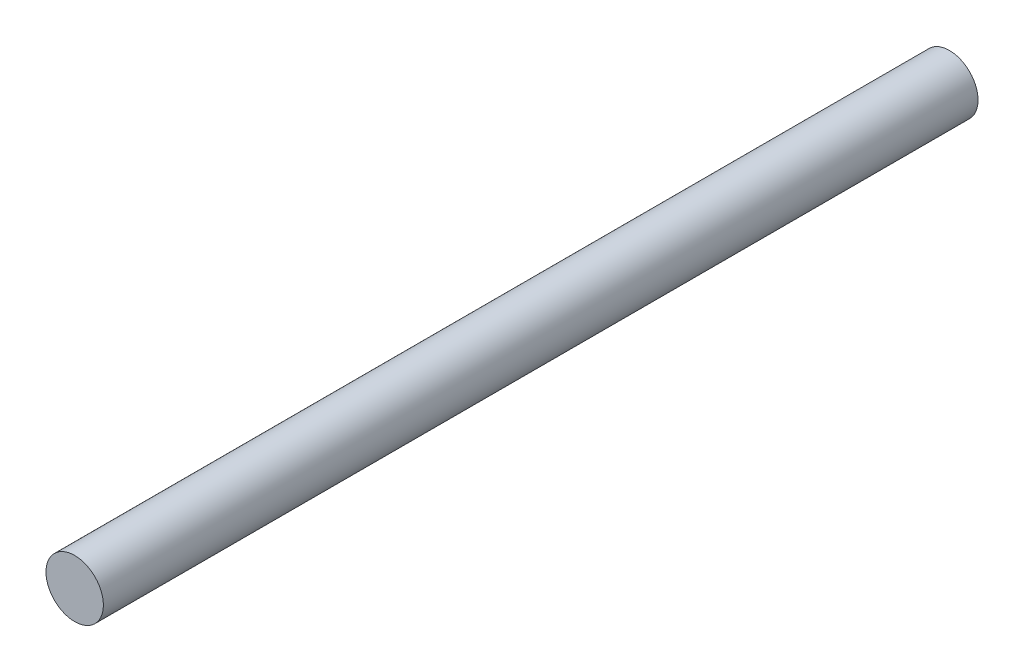
ISO-10303-21;
HEADER;
FILE_DESCRIPTION(('STEP AP214'),'2;1');
FILE_NAME('part.step','',(''),(''),'','','');
FILE_SCHEMA(('AUTOMOTIVE_DESIGN { 1 0 10303 214 1 1 1 1 }'));
ENDSEC;
DATA;
#1=APPLICATION_CONTEXT('core data for automotive mechanical design processes');
#2=APPLICATION_PROTOCOL_DEFINITION('international standard','automotive_design',2000,#1);
#3=PRODUCT_CONTEXT('',#1,'mechanical');
#4=PRODUCT('Part','Part','',(#3));
#5=PRODUCT_RELATED_PRODUCT_CATEGORY('part','',(#4));
#6=PRODUCT_DEFINITION_FORMATION('','',#4);
#7=PRODUCT_DEFINITION_CONTEXT('part definition',#1,'design');
#8=PRODUCT_DEFINITION('design','',#6,#7);
#9=PRODUCT_DEFINITION_SHAPE('','',#8);
#10=(LENGTH_UNIT() NAMED_UNIT(*) SI_UNIT(.MILLI.,.METRE.));
#11=(NAMED_UNIT(*) PLANE_ANGLE_UNIT() SI_UNIT($,.RADIAN.));
#12=(NAMED_UNIT(*) SI_UNIT($,.STERADIAN.) SOLID_ANGLE_UNIT());
#13=UNCERTAINTY_MEASURE_WITH_UNIT(LENGTH_MEASURE(1.E-05),#10,'distance_accuracy_value','');
#14=(GEOMETRIC_REPRESENTATION_CONTEXT(3) GLOBAL_UNCERTAINTY_ASSIGNED_CONTEXT((#13)) GLOBAL_UNIT_ASSIGNED_CONTEXT((#10,
#11,#12)) REPRESENTATION_CONTEXT('',''));
#15=CARTESIAN_POINT('',(0.,0.,0.));
#16=DIRECTION('',(0.,0.,1.));
#17=DIRECTION('',(1.,0.,0.));
#18=AXIS2_PLACEMENT_3D('',#15,#16,#17);
#19=CARTESIAN_POINT('',(0.,0.,30.5));
#20=DIRECTION('',(0.,0.,-1.));
#21=DIRECTION('',(-1.,0.,0.));
#22=AXIS2_PLACEMENT_3D('',#19,#20,#21);
#23=CYLINDRICAL_SURFACE('',#22,2.);
#24=CARTESIAN_POINT('',(0.,0.,30.5));
#25=DIRECTION('',(0.,0.,1.));
#26=DIRECTION('',(1.,0.,0.));
#27=AXIS2_PLACEMENT_3D('',#24,#25,#26);
#28=CIRCLE('',#27,2.);
#29=CARTESIAN_POINT('',(-2.,0.,30.5));
#30=VERTEX_POINT('',#29);
#31=EDGE_CURVE('E10',#30,#30,#28,.T.);
#32=CARTESIAN_POINT('',(0.,0.,-30.5));
#33=DIRECTION('',(0.,0.,1.));
#34=DIRECTION('',(1.,0.,0.));
#35=AXIS2_PLACEMENT_3D('',#32,#33,#34);
#36=CIRCLE('',#35,2.);
#37=CARTESIAN_POINT('',(-2.,0.,-30.5));
#38=VERTEX_POINT('',#37);
#39=EDGE_CURVE('E41',#38,#38,#36,.T.);
#40=CARTESIAN_POINT('',(-2.,0.,30.5));
#41=CARTESIAN_POINT('',(-2.,0.,29.8645833333333));
#42=CARTESIAN_POINT('',(-2.,0.,29.2291666666667));
#43=CARTESIAN_POINT('',(-2.,0.,27.9583333333333));
#44=CARTESIAN_POINT('',(-2.,0.,27.3229166666667));
#45=CARTESIAN_POINT('',(-2.,0.,26.0520833333333));
#46=CARTESIAN_POINT('',(-2.,0.,25.4166666666667));
#47=CARTESIAN_POINT('',(-2.,0.,24.1458333333333));
#48=CARTESIAN_POINT('',(-2.,0.,23.5104166666667));
#49=CARTESIAN_POINT('',(-2.,0.,22.2395833333333));
#50=CARTESIAN_POINT('',(-2.,0.,21.6041666666667));
#51=CARTESIAN_POINT('',(-2.,0.,20.3333333333333));
#52=CARTESIAN_POINT('',(-2.,0.,19.6979166666667));
#53=CARTESIAN_POINT('',(-2.,0.,18.4270833333333));
#54=CARTESIAN_POINT('',(-2.,0.,17.7916666666667));
#55=CARTESIAN_POINT('',(-2.,0.,16.5208333333333));
#56=CARTESIAN_POINT('',(-2.,0.,15.8854166666667));
#57=CARTESIAN_POINT('',(-2.,0.,14.6145833333333));
#58=CARTESIAN_POINT('',(-2.,0.,13.9791666666667));
#59=CARTESIAN_POINT('',(-2.,0.,12.7083333333333));
#60=CARTESIAN_POINT('',(-2.,0.,12.0729166666667));
#61=CARTESIAN_POINT('',(-2.,0.,10.8020833333333));
#62=CARTESIAN_POINT('',(-2.,0.,10.1666666666667));
#63=CARTESIAN_POINT('',(-2.,0.,8.89583333333333));
#64=CARTESIAN_POINT('',(-2.,0.,8.26041666666666));
#65=CARTESIAN_POINT('',(-2.,0.,6.98958333333333));
#66=CARTESIAN_POINT('',(-2.,0.,6.35416666666666));
#67=CARTESIAN_POINT('',(-2.,0.,5.08333333333333));
#68=CARTESIAN_POINT('',(-2.,0.,4.44791666666666));
#69=CARTESIAN_POINT('',(-2.,0.,3.17708333333333));
#70=CARTESIAN_POINT('',(-2.,0.,2.54166666666666));
#71=CARTESIAN_POINT('',(-2.,0.,1.27083333333333));
#72=CARTESIAN_POINT('',(-2.,0.,0.635416666666664));
#73=CARTESIAN_POINT('',(-2.,0.,-0.635416666666668));
#74=CARTESIAN_POINT('',(-2.,0.,-1.27083333333333));
#75=CARTESIAN_POINT('',(-2.,0.,-2.54166666666667));
#76=CARTESIAN_POINT('',(-2.,0.,-3.17708333333333));
#77=CARTESIAN_POINT('',(-2.,0.,-4.44791666666667));
#78=CARTESIAN_POINT('',(-2.,0.,-5.08333333333334));
#79=CARTESIAN_POINT('',(-2.,0.,-6.35416666666667));
#80=CARTESIAN_POINT('',(-2.,0.,-6.98958333333333));
#81=CARTESIAN_POINT('',(-2.,0.,-8.26041666666667));
#82=CARTESIAN_POINT('',(-2.,0.,-8.89583333333334));
#83=CARTESIAN_POINT('',(-2.,0.,-10.1666666666667));
#84=CARTESIAN_POINT('',(-2.,0.,-10.8020833333333));
#85=CARTESIAN_POINT('',(-2.,0.,-12.0729166666667));
#86=CARTESIAN_POINT('',(-2.,0.,-12.7083333333333));
#87=CARTESIAN_POINT('',(-2.,0.,-13.9791666666667));
#88=CARTESIAN_POINT('',(-2.,0.,-14.6145833333333));
#89=CARTESIAN_POINT('',(-2.,0.,-15.8854166666667));
#90=CARTESIAN_POINT('',(-2.,0.,-16.5208333333333));
#91=CARTESIAN_POINT('',(-2.,0.,-17.7916666666667));
#92=CARTESIAN_POINT('',(-2.,0.,-18.4270833333333));
#93=CARTESIAN_POINT('',(-2.,0.,-19.6979166666667));
#94=CARTESIAN_POINT('',(-2.,0.,-20.3333333333333));
#95=CARTESIAN_POINT('',(-2.,0.,-21.6041666666667));
#96=CARTESIAN_POINT('',(-2.,0.,-22.2395833333333));
#97=CARTESIAN_POINT('',(-2.,0.,-23.5104166666667));
#98=CARTESIAN_POINT('',(-2.,0.,-24.1458333333333));
#99=CARTESIAN_POINT('',(-2.,0.,-25.4166666666667));
#100=CARTESIAN_POINT('',(-2.,0.,-26.0520833333333));
#101=CARTESIAN_POINT('',(-2.,0.,-27.3229166666667));
#102=CARTESIAN_POINT('',(-2.,0.,-27.9583333333333));
#103=CARTESIAN_POINT('',(-2.,0.,-29.2291666666667));
#104=CARTESIAN_POINT('',(-2.,0.,-29.8645833333333));
#105=CARTESIAN_POINT('',(-2.,0.,-30.5));
#106=B_SPLINE_CURVE_WITH_KNOTS('',3,(#40,#41,#42,#43,#44,#45,#46,#47,#48,#49,#50,#51,#52,#53,
#54,#55,#56,#57,#58,#59,#60,#61,#62,#63,#64,#65,#66,#67,#68,#69,#70,#71,#72,#73,#74,#75,#76,#77,
#78,#79,#80,#81,#82,#83,#84,#85,#86,#87,#88,#89,#90,#91,#92,#93,#94,#95,#96,#97,#98,#99,#100,
#101,#102,#103,#104,#105),.UNSPECIFIED.,.F.,.F.,(4,2,2,2,2,2,2,2,2,2,2,2,2,2,2,2,2,2,2,2,2,2,2,
2,2,2,2,2,2,2,2,2,4),(0.,1.90625,3.8125,5.71875,7.625,9.53125,11.4375,13.34375,15.25,17.15625,
19.0625,20.96875,22.875,24.78125,26.6875,28.59375,30.5,32.40625,34.3125,36.21875,38.125,
40.03125,41.9375,43.84375,45.75,47.65625,49.5625,51.46875,53.375,55.28125,57.1875,59.09375,61.),.UNSPECIFIED.);
#107=EDGE_CURVE('BSEAM38',#30,#38,#106,.T.);
#108=ORIENTED_EDGE('',*,*,#31,.F.);
#109=ORIENTED_EDGE('',*,*,#39,.T.);
#110=ORIENTED_EDGE('',*,*,#107,.T.);
#111=ORIENTED_EDGE('',*,*,#107,.F.);
#112=EDGE_LOOP('',(#108,#110,#109,#111));
#113=FACE_BOUND('',#112,.T.);
#114=ADVANCED_FACE('F38',(#113),#23,.T.);
#115=CARTESIAN_POINT('',(0.,0.,30.5));
#116=DIRECTION('',(0.,0.,1.));
#117=DIRECTION('',(1.,0.,0.));
#118=AXIS2_PLACEMENT_3D('',#115,#116,#117);
#119=PLANE('',#118);
#120=ORIENTED_EDGE('',*,*,#31,.T.);
#121=EDGE_LOOP('',(#120));
#122=FACE_BOUND('',#121,.T.);
#123=ADVANCED_FACE('F53',(#122),#119,.T.);
#124=CARTESIAN_POINT('',(0.,0.,-30.5));
#125=DIRECTION('',(0.,0.,1.));
#126=DIRECTION('',(1.,0.,0.));
#127=AXIS2_PLACEMENT_3D('',#124,#125,#126);
#128=PLANE('',#127);
#129=ORIENTED_EDGE('',*,*,#39,.F.);
#130=EDGE_LOOP('',(#129));
#131=FACE_BOUND('',#130,.T.);
#132=ADVANCED_FACE('F51',(#131),#128,.F.);
#133=CLOSED_SHELL('',(#114,#123,#132));
#134=MANIFOLD_SOLID_BREP('B2',#133);
#135=ADVANCED_BREP_SHAPE_REPRESENTATION('',(#18,#134),#14);
#136=SHAPE_DEFINITION_REPRESENTATION(#9,#135);
ENDSEC;
END-ISO-10303-21;
